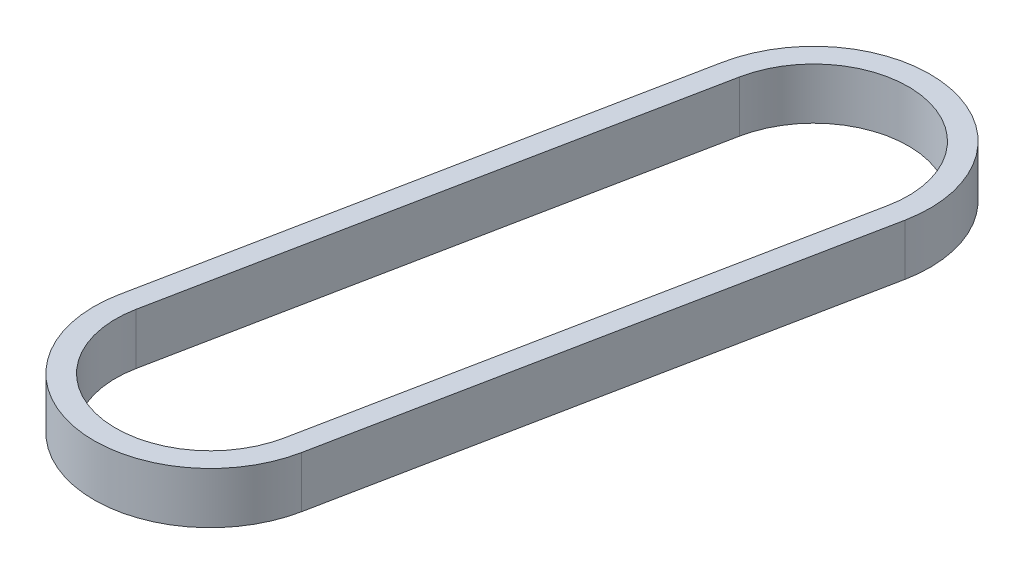
ISO-10303-21;
HEADER;
FILE_DESCRIPTION(('STEP AP214'),'2;1');
FILE_NAME('part.step','',(''),(''),'','','');
FILE_SCHEMA(('AUTOMOTIVE_DESIGN { 1 0 10303 214 1 1 1 1 }'));
ENDSEC;
DATA;
#1=APPLICATION_CONTEXT('core data for automotive mechanical design processes');
#2=APPLICATION_PROTOCOL_DEFINITION('international standard','automotive_design',2000,#1);
#3=PRODUCT_CONTEXT('',#1,'mechanical');
#4=PRODUCT('Part','Part','',(#3));
#5=PRODUCT_RELATED_PRODUCT_CATEGORY('part','',(#4));
#6=PRODUCT_DEFINITION_FORMATION('','',#4);
#7=PRODUCT_DEFINITION_CONTEXT('part definition',#1,'design');
#8=PRODUCT_DEFINITION('design','',#6,#7);
#9=PRODUCT_DEFINITION_SHAPE('','',#8);
#10=(LENGTH_UNIT() NAMED_UNIT(*) SI_UNIT(.MILLI.,.METRE.));
#11=(NAMED_UNIT(*) PLANE_ANGLE_UNIT() SI_UNIT($,.RADIAN.));
#12=(NAMED_UNIT(*) SI_UNIT($,.STERADIAN.) SOLID_ANGLE_UNIT());
#13=UNCERTAINTY_MEASURE_WITH_UNIT(LENGTH_MEASURE(1.E-05),#10,'distance_accuracy_value','');
#14=(GEOMETRIC_REPRESENTATION_CONTEXT(3) GLOBAL_UNCERTAINTY_ASSIGNED_CONTEXT((#13)) GLOBAL_UNIT_ASSIGNED_CONTEXT((#10,
#11,#12)) REPRESENTATION_CONTEXT('',''));
#15=CARTESIAN_POINT('',(0.,0.,0.));
#16=DIRECTION('',(0.,0.,1.));
#17=DIRECTION('',(1.,0.,0.));
#18=AXIS2_PLACEMENT_3D('',#15,#16,#17);
#19=CARTESIAN_POINT('',(59.4106304023227,258.892577481275,11.868594574428));
#20=DIRECTION('',(0.980623603934515,0.,0.19590137162992));
#21=DIRECTION('',(0.19590137162992,0.,-0.980623603934515));
#22=AXIS2_PLACEMENT_3D('',#19,#20,#21);
#23=PLANE('',#22);
#24=DIRECTION('',(-0.19590137162992,0.,0.980623603934515));
#25=VECTOR('',#24,1.);
#26=CARTESIAN_POINT('',(59.4106304023227,249.892577481275,11.868594574428));
#27=LINE('',#26,#25);
#28=CARTESIAN_POINT('',(25.4842735541618,249.892577481275,181.693777747013));
#29=VERTEX_POINT('',#28);
#30=CARTESIAN_POINT('',(7.85450828338955,249.892577481275,269.943103479165));
#31=VERTEX_POINT('',#30);
#32=EDGE_CURVE('E149',#29,#31,#27,.T.);
#33=ORIENTED_EDGE('',*,*,#32,.F.);
#34=DIRECTION('',(0.,-1.,0.));
#35=VECTOR('',#34,1.);
#36=CARTESIAN_POINT('',(25.4842735541618,258.892577481275,181.693777747013));
#37=LINE('',#36,#35);
#38=CARTESIAN_POINT('',(25.4842735541618,258.892577481275,181.693777747013));
#39=VERTEX_POINT('',#38);
#40=EDGE_CURVE('E11',#39,#29,#37,.T.);
#41=ORIENTED_EDGE('',*,*,#40,.F.);
#42=DIRECTION('',(-0.19590137162992,0.,0.980623603934515));
#43=VECTOR('',#42,1.);
#44=CARTESIAN_POINT('',(59.4106304023227,258.892577481275,11.868594574428));
#45=LINE('',#44,#43);
#46=CARTESIAN_POINT('',(7.85450828338955,258.892577481275,269.943103479165));
#47=VERTEX_POINT('',#46);
#48=EDGE_CURVE('E122',#39,#47,#45,.T.);
#49=ORIENTED_EDGE('',*,*,#48,.T.);
#50=DIRECTION('',(0.,-1.,0.));
#51=VECTOR('',#50,1.);
#52=CARTESIAN_POINT('',(7.85450828338955,258.892577481275,269.943103479165));
#53=LINE('',#52,#51);
#54=EDGE_CURVE('E88',#47,#31,#53,.T.);
#55=ORIENTED_EDGE('',*,*,#54,.T.);
#56=EDGE_LOOP('',(#33,#41,#49,#55));
#57=FACE_BOUND('',#56,.T.);
#58=ADVANCED_FACE('F35',(#57),#23,.T.);
#59=CARTESIAN_POINT('',(5.47955203389771,258.892577481275,177.697389765763));
#60=DIRECTION('',(0.,-1.,0.));
#61=DIRECTION('',(1.,0.,0.));
#62=AXIS2_PLACEMENT_3D('',#59,#60,#61);
#63=CYLINDRICAL_SURFACE('',#62,20.4);
#64=CARTESIAN_POINT('',(5.4795520338977,249.892577481275,177.697389765763));
#65=DIRECTION('',(0.,1.,0.));
#66=DIRECTION('',(-1.,0.,0.));
#67=AXIS2_PLACEMENT_3D('',#64,#65,#66);
#68=CIRCLE('',#67,20.4);
#69=CARTESIAN_POINT('',(-14.5251694863664,249.892577481275,173.701001784512));
#70=VERTEX_POINT('',#69);
#71=EDGE_CURVE('E127',#29,#70,#68,.T.);
#72=ORIENTED_EDGE('',*,*,#71,.T.);
#73=DIRECTION('',(0.,-1.,0.));
#74=VECTOR('',#73,1.);
#75=CARTESIAN_POINT('',(-14.5251694863664,258.892577481275,173.701001784512));
#76=LINE('',#75,#74);
#77=CARTESIAN_POINT('',(-14.5251694863664,258.892577481275,173.701001784512));
#78=VERTEX_POINT('',#77);
#79=EDGE_CURVE('E45',#78,#70,#76,.T.);
#80=ORIENTED_EDGE('',*,*,#79,.F.);
#81=CARTESIAN_POINT('',(5.47955203389771,258.892577481275,177.697389765763));
#82=DIRECTION('',(0.,1.,0.));
#83=DIRECTION('',(-1.,0.,0.));
#84=AXIS2_PLACEMENT_3D('',#81,#82,#83);
#85=CIRCLE('',#84,20.4);
#86=EDGE_CURVE('E118',#39,#78,#85,.T.);
#87=ORIENTED_EDGE('',*,*,#86,.F.);
#88=ORIENTED_EDGE('',*,*,#40,.T.);
#89=EDGE_LOOP('',(#72,#80,#87,#88));
#90=FACE_BOUND('',#89,.T.);
#91=ADVANCED_FACE('F125',(#90),#63,.T.);
#92=CARTESIAN_POINT('',(19.4011873617943,258.892577481275,3.87581861192723));
#93=DIRECTION('',(0.980623603934515,0.,0.19590137162992));
#94=DIRECTION('',(0.19590137162992,0.,-0.980623603934515));
#95=AXIS2_PLACEMENT_3D('',#92,#93,#94);
#96=PLANE('',#95);
#97=DIRECTION('',(-0.19590137162992,0.,0.980623603934515));
#98=VECTOR('',#97,1.);
#99=CARTESIAN_POINT('',(19.4011873617943,249.892577481275,3.87581861192723));
#100=LINE('',#99,#98);
#101=CARTESIAN_POINT('',(-32.1549347571387,249.892577481275,261.950327516665));
#102=VERTEX_POINT('',#101);
#103=EDGE_CURVE('E146',#70,#102,#100,.T.);
#104=ORIENTED_EDGE('',*,*,#103,.T.);
#105=DIRECTION('',(0.,-1.,0.));
#106=VECTOR('',#105,1.);
#107=CARTESIAN_POINT('',(-32.1549347571387,258.892577481275,261.950327516665));
#108=LINE('',#107,#106);
#109=CARTESIAN_POINT('',(-32.1549347571387,258.892577481275,261.950327516665));
#110=VERTEX_POINT('',#109);
#111=EDGE_CURVE('E117',#110,#102,#108,.T.);
#112=ORIENTED_EDGE('',*,*,#111,.F.);
#113=DIRECTION('',(-0.19590137162992,0.,0.980623603934515));
#114=VECTOR('',#113,1.);
#115=CARTESIAN_POINT('',(19.4011873617943,258.892577481275,3.87581861192723));
#116=LINE('',#115,#114);
#117=EDGE_CURVE('E111',#78,#110,#116,.T.);
#118=ORIENTED_EDGE('',*,*,#117,.F.);
#119=ORIENTED_EDGE('',*,*,#79,.T.);
#120=EDGE_LOOP('',(#104,#112,#118,#119));
#121=FACE_BOUND('',#120,.T.);
#122=ADVANCED_FACE('F114',(#121),#96,.F.);
#123=CARTESIAN_POINT('',(5.47955203389771,258.892577481275,177.697389765763));
#124=DIRECTION('',(0.,-1.,0.));
#125=DIRECTION('',(1.,0.,0.));
#126=AXIS2_PLACEMENT_3D('',#123,#124,#125);
#127=CYLINDRICAL_SURFACE('',#126,16.6);
#128=CARTESIAN_POINT('',(5.4795520338977,249.892577481275,177.697389765763));
#129=DIRECTION('',(0.,1.,0.));
#130=DIRECTION('',(-1.,0.,0.));
#131=AXIS2_PLACEMENT_3D('',#128,#129,#130);
#132=CIRCLE('',#131,16.6);
#133=CARTESIAN_POINT('',(21.7579038592107,249.892577481275,180.949352534819));
#134=VERTEX_POINT('',#133);
#135=CARTESIAN_POINT('',(-10.7987997914153,249.892577481275,174.445426996706));
#136=VERTEX_POINT('',#135);
#137=EDGE_CURVE('E159',#134,#136,#132,.T.);
#138=ORIENTED_EDGE('',*,*,#137,.F.);
#139=DIRECTION('',(0.,-1.,0.));
#140=VECTOR('',#139,1.);
#141=CARTESIAN_POINT('',(21.7579038592107,258.892577481275,180.949352534819));
#142=LINE('',#141,#140);
#143=CARTESIAN_POINT('',(21.7579038592107,258.892577481275,180.949352534819));
#144=VERTEX_POINT('',#143);
#145=EDGE_CURVE('E39',#144,#134,#142,.T.);
#146=ORIENTED_EDGE('',*,*,#145,.F.);
#147=CARTESIAN_POINT('',(5.47955203389771,258.892577481275,177.697389765763));
#148=DIRECTION('',(0.,1.,0.));
#149=DIRECTION('',(-1.,0.,0.));
#150=AXIS2_PLACEMENT_3D('',#147,#148,#149);
#151=CIRCLE('',#150,16.6);
#152=CARTESIAN_POINT('',(-10.7987997914153,258.892577481275,174.445426996706));
#153=VERTEX_POINT('',#152);
#154=EDGE_CURVE('E145',#144,#153,#151,.T.);
#155=ORIENTED_EDGE('',*,*,#154,.T.);
#156=DIRECTION('',(0.,-1.,0.));
#157=VECTOR('',#156,1.);
#158=CARTESIAN_POINT('',(-10.7987997914153,258.892577481275,174.445426996706));
#159=LINE('',#158,#157);
#160=EDGE_CURVE('E132',#153,#136,#159,.T.);
#161=ORIENTED_EDGE('',*,*,#160,.T.);
#162=EDGE_LOOP('',(#138,#146,#155,#161));
#163=FACE_BOUND('',#162,.T.);
#164=ADVANCED_FACE('F37',(#163),#127,.F.);
#165=CARTESIAN_POINT('',(55.6842607073715,258.892577481275,11.1241693622343));
#166=DIRECTION('',(0.980623603934515,0.,0.19590137162992));
#167=DIRECTION('',(0.19590137162992,0.,-0.980623603934515));
#168=AXIS2_PLACEMENT_3D('',#165,#166,#167);
#169=PLANE('',#168);
#170=DIRECTION('',(-0.19590137162992,0.,0.980623603934515));
#171=VECTOR('',#170,1.);
#172=CARTESIAN_POINT('',(55.6842607073715,249.892577481275,11.1241693622343));
#173=LINE('',#172,#171);
#174=CARTESIAN_POINT('',(4.12813858843839,249.892577481275,269.198678266972));
#175=VERTEX_POINT('',#174);
#176=EDGE_CURVE('E157',#134,#175,#173,.T.);
#177=ORIENTED_EDGE('',*,*,#176,.T.);
#178=DIRECTION('',(0.,-1.,0.));
#179=VECTOR('',#178,1.);
#180=CARTESIAN_POINT('',(4.12813858843839,258.892577481275,269.198678266972));
#181=LINE('',#180,#179);
#182=CARTESIAN_POINT('',(4.12813858843839,258.892577481275,269.198678266972));
#183=VERTEX_POINT('',#182);
#184=EDGE_CURVE('E135',#183,#175,#181,.T.);
#185=ORIENTED_EDGE('',*,*,#184,.F.);
#186=DIRECTION('',(-0.19590137162992,0.,0.980623603934515));
#187=VECTOR('',#186,1.);
#188=CARTESIAN_POINT('',(55.6842607073715,258.892577481275,11.1241693622343));
#189=LINE('',#188,#187);
#190=EDGE_CURVE('E169',#144,#183,#189,.T.);
#191=ORIENTED_EDGE('',*,*,#190,.F.);
#192=ORIENTED_EDGE('',*,*,#145,.T.);
#193=EDGE_LOOP('',(#177,#185,#191,#192));
#194=FACE_BOUND('',#193,.T.);
#195=ADVANCED_FACE('F180',(#194),#169,.F.);
#196=CARTESIAN_POINT('',(-12.1502132368746,258.892577481275,265.946715497915));
#197=DIRECTION('',(0.,-1.,0.));
#198=DIRECTION('',(1.,0.,0.));
#199=AXIS2_PLACEMENT_3D('',#196,#197,#198);
#200=CYLINDRICAL_SURFACE('',#199,16.6);
#201=CARTESIAN_POINT('',(-12.1502132368746,249.892577481275,265.946715497915));
#202=DIRECTION('',(0.,1.,0.));
#203=DIRECTION('',(-1.,0.,0.));
#204=AXIS2_PLACEMENT_3D('',#201,#202,#203);
#205=CIRCLE('',#204,16.6);
#206=CARTESIAN_POINT('',(-28.4285650621875,249.892577481275,262.694752728858));
#207=VERTEX_POINT('',#206);
#208=EDGE_CURVE('E154',#207,#175,#205,.T.);
#209=ORIENTED_EDGE('',*,*,#208,.F.);
#210=DIRECTION('',(0.,-1.,0.));
#211=VECTOR('',#210,1.);
#212=CARTESIAN_POINT('',(-28.4285650621875,258.892577481275,262.694752728858));
#213=LINE('',#212,#211);
#214=CARTESIAN_POINT('',(-28.4285650621875,258.892577481275,262.694752728858));
#215=VERTEX_POINT('',#214);
#216=EDGE_CURVE('E134',#215,#207,#213,.T.);
#217=ORIENTED_EDGE('',*,*,#216,.F.);
#218=CARTESIAN_POINT('',(-12.1502132368746,258.892577481275,265.946715497915));
#219=DIRECTION('',(0.,1.,0.));
#220=DIRECTION('',(-1.,0.,0.));
#221=AXIS2_PLACEMENT_3D('',#218,#219,#220);
#222=CIRCLE('',#221,16.6);
#223=EDGE_CURVE('E167',#215,#183,#222,.T.);
#224=ORIENTED_EDGE('',*,*,#223,.T.);
#225=ORIENTED_EDGE('',*,*,#184,.T.);
#226=EDGE_LOOP('',(#209,#217,#224,#225));
#227=FACE_BOUND('',#226,.T.);
#228=ADVANCED_FACE('F181',(#227),#200,.F.);
#229=CARTESIAN_POINT('',(23.1275570567455,258.892577481275,4.62024382412093));
#230=DIRECTION('',(0.980623603934515,0.,0.19590137162992));
#231=DIRECTION('',(0.19590137162992,0.,-0.980623603934515));
#232=AXIS2_PLACEMENT_3D('',#229,#230,#231);
#233=PLANE('',#232);
#234=DIRECTION('',(-0.19590137162992,0.,0.980623603934515));
#235=VECTOR('',#234,1.);
#236=CARTESIAN_POINT('',(23.1275570567455,249.892577481275,4.62024382412093));
#237=LINE('',#236,#235);
#238=EDGE_CURVE('E151',#136,#207,#237,.T.);
#239=ORIENTED_EDGE('',*,*,#238,.F.);
#240=ORIENTED_EDGE('',*,*,#160,.F.);
#241=DIRECTION('',(-0.19590137162992,0.,0.980623603934515));
#242=VECTOR('',#241,1.);
#243=CARTESIAN_POINT('',(23.1275570567455,258.892577481275,4.62024382412093));
#244=LINE('',#243,#242);
#245=EDGE_CURVE('E164',#153,#215,#244,.T.);
#246=ORIENTED_EDGE('',*,*,#245,.T.);
#247=ORIENTED_EDGE('',*,*,#216,.T.);
#248=EDGE_LOOP('',(#239,#240,#246,#247));
#249=FACE_BOUND('',#248,.T.);
#250=ADVANCED_FACE('F177',(#249),#233,.T.);
#251=CARTESIAN_POINT('',(-12.1502132368746,258.892577481275,265.946715497915));
#252=DIRECTION('',(0.,-1.,0.));
#253=DIRECTION('',(1.,0.,0.));
#254=AXIS2_PLACEMENT_3D('',#251,#252,#253);
#255=CYLINDRICAL_SURFACE('',#254,20.4);
#256=CARTESIAN_POINT('',(-12.1502132368746,249.892577481275,265.946715497915));
#257=DIRECTION('',(0.,1.,0.));
#258=DIRECTION('',(-1.,0.,0.));
#259=AXIS2_PLACEMENT_3D('',#256,#257,#258);
#260=CIRCLE('',#259,20.4);
#261=EDGE_CURVE('E81',#102,#31,#260,.T.);
#262=ORIENTED_EDGE('',*,*,#261,.T.);
#263=ORIENTED_EDGE('',*,*,#54,.F.);
#264=CARTESIAN_POINT('',(-12.1502132368746,258.892577481275,265.946715497915));
#265=DIRECTION('',(0.,1.,0.));
#266=DIRECTION('',(-1.,0.,0.));
#267=AXIS2_PLACEMENT_3D('',#264,#265,#266);
#268=CIRCLE('',#267,20.4);
#269=EDGE_CURVE('E54',#110,#47,#268,.T.);
#270=ORIENTED_EDGE('',*,*,#269,.F.);
#271=ORIENTED_EDGE('',*,*,#111,.T.);
#272=EDGE_LOOP('',(#262,#263,#270,#271));
#273=FACE_BOUND('',#272,.T.);
#274=ADVANCED_FACE('F188',(#273),#255,.T.);
#275=CARTESIAN_POINT('',(1.30667916412081E-13,258.892577481275,0.));
#276=DIRECTION('',(0.,1.,0.));
#277=DIRECTION('',(-1.,0.,0.));
#278=AXIS2_PLACEMENT_3D('',#275,#276,#277);
#279=PLANE('',#278);
#280=ORIENTED_EDGE('',*,*,#154,.F.);
#281=ORIENTED_EDGE('',*,*,#190,.T.);
#282=ORIENTED_EDGE('',*,*,#223,.F.);
#283=ORIENTED_EDGE('',*,*,#245,.F.);
#284=EDGE_LOOP('',(#280,#281,#282,#283));
#285=FACE_BOUND('',#284,.T.);
#286=ORIENTED_EDGE('',*,*,#48,.F.);
#287=ORIENTED_EDGE('',*,*,#86,.T.);
#288=ORIENTED_EDGE('',*,*,#117,.T.);
#289=ORIENTED_EDGE('',*,*,#269,.T.);
#290=EDGE_LOOP('',(#286,#287,#288,#289));
#291=FACE_BOUND('',#290,.T.);
#292=ADVANCED_FACE('F121',(#285,#291),#279,.T.);
#293=CARTESIAN_POINT('',(1.25326454304524E-13,249.892577481275,0.));
#294=DIRECTION('',(0.,1.,0.));
#295=DIRECTION('',(-1.,0.,0.));
#296=AXIS2_PLACEMENT_3D('',#293,#294,#295);
#297=PLANE('',#296);
#298=ORIENTED_EDGE('',*,*,#137,.T.);
#299=ORIENTED_EDGE('',*,*,#238,.T.);
#300=ORIENTED_EDGE('',*,*,#208,.T.);
#301=ORIENTED_EDGE('',*,*,#176,.F.);
#302=EDGE_LOOP('',(#298,#299,#300,#301));
#303=FACE_BOUND('',#302,.T.);
#304=ORIENTED_EDGE('',*,*,#32,.T.);
#305=ORIENTED_EDGE('',*,*,#261,.F.);
#306=ORIENTED_EDGE('',*,*,#103,.F.);
#307=ORIENTED_EDGE('',*,*,#71,.F.);
#308=EDGE_LOOP('',(#304,#305,#306,#307));
#309=FACE_BOUND('',#308,.T.);
#310=ADVANCED_FACE('F179',(#303,#309),#297,.F.);
#311=CLOSED_SHELL('',(#58,#91,#122,#164,#195,#228,#250,#274,#292,#310));
#312=MANIFOLD_SOLID_BREP('B2',#311);
#313=ADVANCED_BREP_SHAPE_REPRESENTATION('',(#18,#312),#14);
#314=SHAPE_DEFINITION_REPRESENTATION(#9,#313);
ENDSEC;
END-ISO-10303-21;
